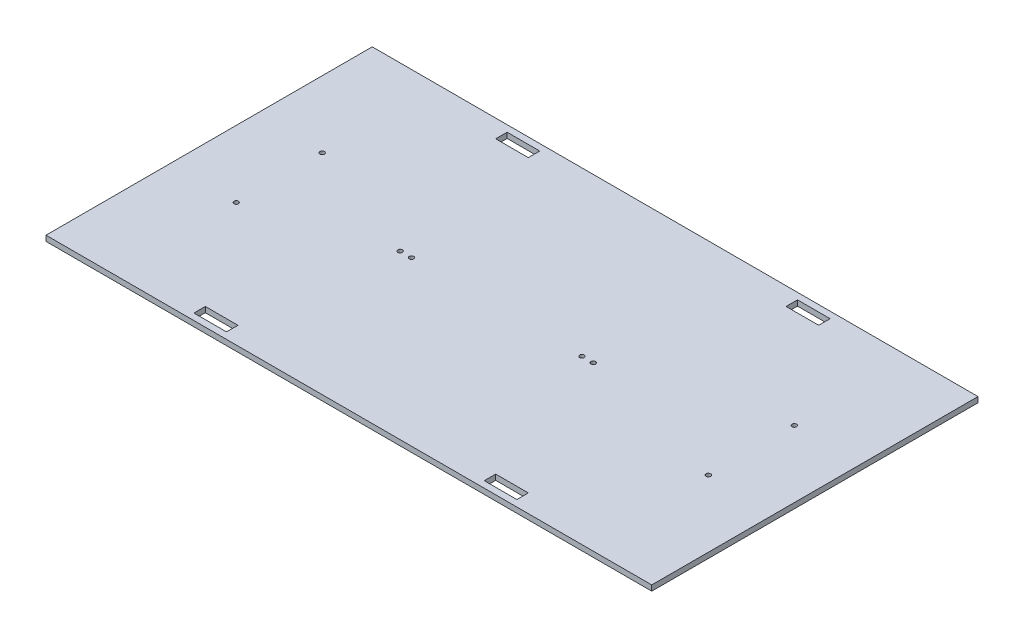
ISO-10303-21;
HEADER;
FILE_DESCRIPTION(('STEP AP214'),'2;1');
FILE_NAME('part.step','',(''),(''),'','','');
FILE_SCHEMA(('AUTOMOTIVE_DESIGN { 1 0 10303 214 1 1 1 1 }'));
ENDSEC;
DATA;
#1=APPLICATION_CONTEXT('core data for automotive mechanical design processes');
#2=APPLICATION_PROTOCOL_DEFINITION('international standard','automotive_design',2000,#1);
#3=PRODUCT_CONTEXT('',#1,'mechanical');
#4=PRODUCT('Part','Part','',(#3));
#5=PRODUCT_RELATED_PRODUCT_CATEGORY('part','',(#4));
#6=PRODUCT_DEFINITION_FORMATION('','',#4);
#7=PRODUCT_DEFINITION_CONTEXT('part definition',#1,'design');
#8=PRODUCT_DEFINITION('design','',#6,#7);
#9=PRODUCT_DEFINITION_SHAPE('','',#8);
#10=(LENGTH_UNIT() NAMED_UNIT(*) SI_UNIT(.MILLI.,.METRE.));
#11=(NAMED_UNIT(*) PLANE_ANGLE_UNIT() SI_UNIT($,.RADIAN.));
#12=(NAMED_UNIT(*) SI_UNIT($,.STERADIAN.) SOLID_ANGLE_UNIT());
#13=UNCERTAINTY_MEASURE_WITH_UNIT(LENGTH_MEASURE(1.E-05),#10,'distance_accuracy_value','');
#14=(GEOMETRIC_REPRESENTATION_CONTEXT(3) GLOBAL_UNCERTAINTY_ASSIGNED_CONTEXT((#13)) GLOBAL_UNIT_ASSIGNED_CONTEXT((#10,
#11,#12)) REPRESENTATION_CONTEXT('',''));
#15=CARTESIAN_POINT('',(0.,0.,0.));
#16=DIRECTION('',(0.,0.,1.));
#17=DIRECTION('',(1.,0.,0.));
#18=AXIS2_PLACEMENT_3D('',#15,#16,#17);
#19=CARTESIAN_POINT('',(278.5,5.,-150.));
#20=DIRECTION('',(-1.,0.,0.));
#21=DIRECTION('',(0.,0.,1.));
#22=AXIS2_PLACEMENT_3D('',#19,#20,#21);
#23=PLANE('',#22);
#24=DIRECTION('',(0.,0.,-1.));
#25=VECTOR('',#24,1.);
#26=CARTESIAN_POINT('',(278.5,0.,-150.));
#27=LINE('',#26,#25);
#28=CARTESIAN_POINT('',(278.5,0.,150.));
#29=VERTEX_POINT('',#28);
#30=CARTESIAN_POINT('',(278.5,0.,-150.));
#31=VERTEX_POINT('',#30);
#32=EDGE_CURVE('E414',#29,#31,#27,.T.);
#33=ORIENTED_EDGE('',*,*,#32,.T.);
#34=DIRECTION('',(0.,-1.,0.));
#35=VECTOR('',#34,1.);
#36=CARTESIAN_POINT('',(278.5,5.,-150.));
#37=LINE('',#36,#35);
#38=CARTESIAN_POINT('',(278.5,5.,-150.));
#39=VERTEX_POINT('',#38);
#40=EDGE_CURVE('E11',#39,#31,#37,.T.);
#41=ORIENTED_EDGE('',*,*,#40,.F.);
#42=DIRECTION('',(0.,0.,-1.));
#43=VECTOR('',#42,1.);
#44=CARTESIAN_POINT('',(278.5,5.,-150.));
#45=LINE('',#44,#43);
#46=CARTESIAN_POINT('',(278.5,5.,150.));
#47=VERTEX_POINT('',#46);
#48=EDGE_CURVE('E415',#47,#39,#45,.T.);
#49=ORIENTED_EDGE('',*,*,#48,.F.);
#50=DIRECTION('',(0.,-1.,0.));
#51=VECTOR('',#50,1.);
#52=CARTESIAN_POINT('',(278.5,5.,150.));
#53=LINE('',#52,#51);
#54=EDGE_CURVE('E429',#47,#29,#53,.T.);
#55=ORIENTED_EDGE('',*,*,#54,.T.);
#56=EDGE_LOOP('',(#33,#41,#49,#55));
#57=FACE_BOUND('',#56,.T.);
#58=ADVANCED_FACE('F42',(#57),#23,.F.);
#59=CARTESIAN_POINT('',(-278.5,5.,-150.));
#60=DIRECTION('',(0.,0.,1.));
#61=DIRECTION('',(1.,0.,0.));
#62=AXIS2_PLACEMENT_3D('',#59,#60,#61);
#63=PLANE('',#62);
#64=DIRECTION('',(-1.,0.,0.));
#65=VECTOR('',#64,1.);
#66=CARTESIAN_POINT('',(-278.5,0.,-150.));
#67=LINE('',#66,#65);
#68=CARTESIAN_POINT('',(-278.5,0.,-150.));
#69=VERTEX_POINT('',#68);
#70=EDGE_CURVE('E433',#31,#69,#67,.T.);
#71=ORIENTED_EDGE('',*,*,#70,.T.);
#72=DIRECTION('',(0.,-1.,0.));
#73=VECTOR('',#72,1.);
#74=CARTESIAN_POINT('',(-278.5,5.,-150.));
#75=LINE('',#74,#73);
#76=CARTESIAN_POINT('',(-278.5,5.,-150.));
#77=VERTEX_POINT('',#76);
#78=EDGE_CURVE('E50',#77,#69,#75,.T.);
#79=ORIENTED_EDGE('',*,*,#78,.F.);
#80=DIRECTION('',(-1.,0.,0.));
#81=VECTOR('',#80,1.);
#82=CARTESIAN_POINT('',(-278.5,5.,-150.));
#83=LINE('',#82,#81);
#84=EDGE_CURVE('E419',#39,#77,#83,.T.);
#85=ORIENTED_EDGE('',*,*,#84,.F.);
#86=ORIENTED_EDGE('',*,*,#40,.T.);
#87=EDGE_LOOP('',(#71,#79,#85,#86));
#88=FACE_BOUND('',#87,.T.);
#89=ADVANCED_FACE('F469',(#88),#63,.F.);
#90=CARTESIAN_POINT('',(-278.5,5.,-150.));
#91=DIRECTION('',(1.,0.,0.));
#92=DIRECTION('',(0.,0.,-1.));
#93=AXIS2_PLACEMENT_3D('',#90,#91,#92);
#94=PLANE('',#93);
#95=DIRECTION('',(0.,0.,1.));
#96=VECTOR('',#95,1.);
#97=CARTESIAN_POINT('',(-278.5,0.,-150.));
#98=LINE('',#97,#96);
#99=CARTESIAN_POINT('',(-278.5,0.,150.));
#100=VERTEX_POINT('',#99);
#101=EDGE_CURVE('E436',#69,#100,#98,.T.);
#102=ORIENTED_EDGE('',*,*,#101,.T.);
#103=DIRECTION('',(0.,-1.,0.));
#104=VECTOR('',#103,1.);
#105=CARTESIAN_POINT('',(-278.5,5.,150.));
#106=LINE('',#105,#104);
#107=CARTESIAN_POINT('',(-278.5,5.,150.));
#108=VERTEX_POINT('',#107);
#109=EDGE_CURVE('E444',#108,#100,#106,.T.);
#110=ORIENTED_EDGE('',*,*,#109,.F.);
#111=DIRECTION('',(0.,0.,1.));
#112=VECTOR('',#111,1.);
#113=CARTESIAN_POINT('',(-278.5,5.,-150.));
#114=LINE('',#113,#112);
#115=EDGE_CURVE('E423',#77,#108,#114,.T.);
#116=ORIENTED_EDGE('',*,*,#115,.F.);
#117=ORIENTED_EDGE('',*,*,#78,.T.);
#118=EDGE_LOOP('',(#102,#110,#116,#117));
#119=FACE_BOUND('',#118,.T.);
#120=ADVANCED_FACE('F454',(#119),#94,.F.);
#121=CARTESIAN_POINT('',(-278.5,5.,150.));
#122=DIRECTION('',(0.,0.,-1.));
#123=DIRECTION('',(-1.,0.,0.));
#124=AXIS2_PLACEMENT_3D('',#121,#122,#123);
#125=PLANE('',#124);
#126=DIRECTION('',(1.,0.,0.));
#127=VECTOR('',#126,1.);
#128=CARTESIAN_POINT('',(-278.5,0.,150.));
#129=LINE('',#128,#127);
#130=EDGE_CURVE('E420',#100,#29,#129,.T.);
#131=ORIENTED_EDGE('',*,*,#130,.T.);
#132=ORIENTED_EDGE('',*,*,#54,.F.);
#133=DIRECTION('',(1.,0.,0.));
#134=VECTOR('',#133,1.);
#135=CARTESIAN_POINT('',(-278.5,5.,150.));
#136=LINE('',#135,#134);
#137=EDGE_CURVE('E426',#108,#47,#136,.T.);
#138=ORIENTED_EDGE('',*,*,#137,.F.);
#139=ORIENTED_EDGE('',*,*,#109,.T.);
#140=EDGE_LOOP('',(#131,#132,#138,#139));
#141=FACE_BOUND('',#140,.T.);
#142=ADVANCED_FACE('F462',(#141),#125,.F.);
#143=CARTESIAN_POINT('',(0.,5.,0.));
#144=DIRECTION('',(0.,1.,0.));
#145=DIRECTION('',(0.,0.,1.));
#146=AXIS2_PLACEMENT_3D('',#143,#144,#145);
#147=PLANE('',#146);
#148=DIRECTION('',(1.,0.,0.));
#149=VECTOR('',#148,1.);
#150=CARTESIAN_POINT('',(0.,5.,-133.5));
#151=LINE('',#150,#149);
#152=CARTESIAN_POINT('',(118.5,5.,-133.5));
#153=VERTEX_POINT('',#152);
#154=CARTESIAN_POINT('',(148.5,5.,-133.5));
#155=VERTEX_POINT('',#154);
#156=EDGE_CURVE('E348',#153,#155,#151,.T.);
#157=ORIENTED_EDGE('',*,*,#156,.F.);
#158=DIRECTION('',(0.,0.,1.));
#159=VECTOR('',#158,1.);
#160=CARTESIAN_POINT('',(118.5,5.,0.));
#161=LINE('',#160,#159);
#162=CARTESIAN_POINT('',(118.5,5.,-144.));
#163=VERTEX_POINT('',#162);
#164=EDGE_CURVE('E340',#163,#153,#161,.T.);
#165=ORIENTED_EDGE('',*,*,#164,.F.);
#166=DIRECTION('',(-1.,0.,0.));
#167=VECTOR('',#166,1.);
#168=CARTESIAN_POINT('',(0.,5.,-144.));
#169=LINE('',#168,#167);
#170=CARTESIAN_POINT('',(148.5,5.,-144.));
#171=VERTEX_POINT('',#170);
#172=EDGE_CURVE('E342',#171,#163,#169,.T.);
#173=ORIENTED_EDGE('',*,*,#172,.F.);
#174=DIRECTION('',(0.,0.,-1.));
#175=VECTOR('',#174,1.);
#176=CARTESIAN_POINT('',(148.5,5.,0.));
#177=LINE('',#176,#175);
#178=EDGE_CURVE('E345',#155,#171,#177,.T.);
#179=ORIENTED_EDGE('',*,*,#178,.F.);
#180=EDGE_LOOP('',(#157,#165,#173,#179));
#181=FACE_BOUND('',#180,.T.);
#182=DIRECTION('',(0.,0.,1.));
#183=VECTOR('',#182,1.);
#184=CARTESIAN_POINT('',(-148.5,5.,0.));
#185=LINE('',#184,#183);
#186=CARTESIAN_POINT('',(-148.5,5.,-144.));
#187=VERTEX_POINT('',#186);
#188=CARTESIAN_POINT('',(-148.5,5.,-133.5));
#189=VERTEX_POINT('',#188);
#190=EDGE_CURVE('E337',#187,#189,#185,.T.);
#191=ORIENTED_EDGE('',*,*,#190,.F.);
#192=DIRECTION('',(-1.,0.,0.));
#193=VECTOR('',#192,1.);
#194=CARTESIAN_POINT('',(0.,5.,-144.));
#195=LINE('',#194,#193);
#196=CARTESIAN_POINT('',(-118.5,5.,-144.));
#197=VERTEX_POINT('',#196);
#198=EDGE_CURVE('E328',#197,#187,#195,.T.);
#199=ORIENTED_EDGE('',*,*,#198,.F.);
#200=DIRECTION('',(0.,0.,-1.));
#201=VECTOR('',#200,1.);
#202=CARTESIAN_POINT('',(-118.5,5.,0.));
#203=LINE('',#202,#201);
#204=CARTESIAN_POINT('',(-118.5,5.,-133.5));
#205=VERTEX_POINT('',#204);
#206=EDGE_CURVE('E331',#205,#197,#203,.T.);
#207=ORIENTED_EDGE('',*,*,#206,.F.);
#208=DIRECTION('',(1.,0.,0.));
#209=VECTOR('',#208,1.);
#210=CARTESIAN_POINT('',(0.,5.,-133.5));
#211=LINE('',#210,#209);
#212=EDGE_CURVE('E334',#189,#205,#211,.T.);
#213=ORIENTED_EDGE('',*,*,#212,.F.);
#214=EDGE_LOOP('',(#191,#199,#207,#213));
#215=FACE_BOUND('',#214,.T.);
#216=DIRECTION('',(-1.,0.,0.));
#217=VECTOR('',#216,1.);
#218=CARTESIAN_POINT('',(0.,5.,133.5));
#219=LINE('',#218,#217);
#220=CARTESIAN_POINT('',(-118.5,5.,133.5));
#221=VERTEX_POINT('',#220);
#222=CARTESIAN_POINT('',(-148.5,5.,133.5));
#223=VERTEX_POINT('',#222);
#224=EDGE_CURVE('E325',#221,#223,#219,.T.);
#225=ORIENTED_EDGE('',*,*,#224,.F.);
#226=DIRECTION('',(0.,0.,-1.));
#227=VECTOR('',#226,1.);
#228=CARTESIAN_POINT('',(-118.5,5.,0.));
#229=LINE('',#228,#227);
#230=CARTESIAN_POINT('',(-118.5,5.,144.));
#231=VERTEX_POINT('',#230);
#232=EDGE_CURVE('E317',#231,#221,#229,.T.);
#233=ORIENTED_EDGE('',*,*,#232,.F.);
#234=DIRECTION('',(1.,0.,0.));
#235=VECTOR('',#234,1.);
#236=CARTESIAN_POINT('',(0.,5.,144.));
#237=LINE('',#236,#235);
#238=CARTESIAN_POINT('',(-148.5,5.,144.));
#239=VERTEX_POINT('',#238);
#240=EDGE_CURVE('E187',#239,#231,#237,.T.);
#241=ORIENTED_EDGE('',*,*,#240,.F.);
#242=DIRECTION('',(0.,0.,1.));
#243=VECTOR('',#242,1.);
#244=CARTESIAN_POINT('',(-148.5,5.,0.));
#245=LINE('',#244,#243);
#246=EDGE_CURVE('E322',#223,#239,#245,.T.);
#247=ORIENTED_EDGE('',*,*,#246,.F.);
#248=EDGE_LOOP('',(#225,#233,#241,#247));
#249=FACE_BOUND('',#248,.T.);
#250=DIRECTION('',(0.,0.,-1.));
#251=VECTOR('',#250,1.);
#252=CARTESIAN_POINT('',(148.5,5.,0.));
#253=LINE('',#252,#251);
#254=CARTESIAN_POINT('',(148.5,5.,144.));
#255=VERTEX_POINT('',#254);
#256=CARTESIAN_POINT('',(148.5,5.,133.5));
#257=VERTEX_POINT('',#256);
#258=EDGE_CURVE('E314',#255,#257,#253,.T.);
#259=ORIENTED_EDGE('',*,*,#258,.F.);
#260=DIRECTION('',(1.,0.,0.));
#261=VECTOR('',#260,1.);
#262=CARTESIAN_POINT('',(0.,5.,144.));
#263=LINE('',#262,#261);
#264=CARTESIAN_POINT('',(118.5,5.,144.));
#265=VERTEX_POINT('',#264);
#266=EDGE_CURVE('E295',#265,#255,#263,.T.);
#267=ORIENTED_EDGE('',*,*,#266,.F.);
#268=DIRECTION('',(0.,0.,1.));
#269=VECTOR('',#268,1.);
#270=CARTESIAN_POINT('',(118.5,5.,0.));
#271=LINE('',#270,#269);
#272=CARTESIAN_POINT('',(118.5,5.,133.5));
#273=VERTEX_POINT('',#272);
#274=EDGE_CURVE('E307',#273,#265,#271,.T.);
#275=ORIENTED_EDGE('',*,*,#274,.F.);
#276=DIRECTION('',(-1.,0.,0.));
#277=VECTOR('',#276,1.);
#278=CARTESIAN_POINT('',(0.,5.,133.5));
#279=LINE('',#278,#277);
#280=EDGE_CURVE('E311',#257,#273,#279,.T.);
#281=ORIENTED_EDGE('',*,*,#280,.F.);
#282=EDGE_LOOP('',(#259,#267,#275,#281));
#283=FACE_BOUND('',#282,.T.);
#284=CARTESIAN_POINT('',(217.06,5.,-42.52));
#285=DIRECTION('',(0.,1.,0.));
#286=DIRECTION('',(0.,0.,1.));
#287=AXIS2_PLACEMENT_3D('',#284,#285,#286);
#288=CIRCLE('',#287,2.09999999999999);
#289=CARTESIAN_POINT('',(217.06,5.,-40.42));
#290=VERTEX_POINT('',#289);
#291=EDGE_CURVE('E378',#290,#290,#288,.T.);
#292=ORIENTED_EDGE('',*,*,#291,.F.);
#293=EDGE_LOOP('',(#292));
#294=FACE_BOUND('',#293,.T.);
#295=CARTESIAN_POINT('',(217.06,5.,36.4800000000001));
#296=DIRECTION('',(0.,1.,0.));
#297=DIRECTION('',(0.,0.,1.));
#298=AXIS2_PLACEMENT_3D('',#295,#296,#297);
#299=CIRCLE('',#298,2.09999999999999);
#300=CARTESIAN_POINT('',(217.06,5.,38.58));
#301=VERTEX_POINT('',#300);
#302=EDGE_CURVE('E374',#301,#301,#299,.T.);
#303=ORIENTED_EDGE('',*,*,#302,.F.);
#304=EDGE_LOOP('',(#303));
#305=FACE_BOUND('',#304,.T.);
#306=CARTESIAN_POINT('',(-217.06,5.,36.4800000000001));
#307=DIRECTION('',(0.,1.,0.));
#308=DIRECTION('',(0.,0.,1.));
#309=AXIS2_PLACEMENT_3D('',#306,#307,#308);
#310=CIRCLE('',#309,2.09999999999999);
#311=CARTESIAN_POINT('',(-217.06,5.,38.58));
#312=VERTEX_POINT('',#311);
#313=EDGE_CURVE('E370',#312,#312,#310,.T.);
#314=ORIENTED_EDGE('',*,*,#313,.F.);
#315=EDGE_LOOP('',(#314));
#316=FACE_BOUND('',#315,.T.);
#317=CARTESIAN_POINT('',(-217.06,5.,-42.52));
#318=DIRECTION('',(0.,1.,0.));
#319=DIRECTION('',(0.,0.,1.));
#320=AXIS2_PLACEMENT_3D('',#317,#318,#319);
#321=CIRCLE('',#320,2.09999999999999);
#322=CARTESIAN_POINT('',(-217.06,5.,-40.42));
#323=VERTEX_POINT('',#322);
#324=EDGE_CURVE('E366',#323,#323,#321,.T.);
#325=ORIENTED_EDGE('',*,*,#324,.F.);
#326=EDGE_LOOP('',(#325));
#327=FACE_BOUND('',#326,.T.);
#328=CARTESIAN_POINT('',(-102.995469166252,5.,-0.150780626409678));
#329=DIRECTION('',(0.,1.,0.));
#330=DIRECTION('',(0.,0.,1.));
#331=AXIS2_PLACEMENT_3D('',#328,#329,#330);
#332=CIRCLE('',#331,2.1);
#333=CARTESIAN_POINT('',(-102.995469166252,5.,1.94921937359033));
#334=VERTEX_POINT('',#333);
#335=EDGE_CURVE('E410',#334,#334,#332,.T.);
#336=ORIENTED_EDGE('',*,*,#335,.F.);
#337=EDGE_LOOP('',(#336));
#338=FACE_BOUND('',#337,.T.);
#339=CARTESIAN_POINT('',(-92.5902008962103,5.,-0.150780626409678));
#340=DIRECTION('',(0.,1.,0.));
#341=DIRECTION('',(0.,0.,1.));
#342=AXIS2_PLACEMENT_3D('',#339,#340,#341);
#343=CIRCLE('',#342,2.09999999999999);
#344=CARTESIAN_POINT('',(-92.5902008962103,5.,1.94921937359031));
#345=VERTEX_POINT('',#344);
#346=EDGE_CURVE('E406',#345,#345,#343,.T.);
#347=ORIENTED_EDGE('',*,*,#346,.F.);
#348=EDGE_LOOP('',(#347));
#349=FACE_BOUND('',#348,.T.);
#350=CARTESIAN_POINT('',(74.7319267324702,5.,0.));
#351=DIRECTION('',(0.,1.,0.));
#352=DIRECTION('',(0.,0.,1.));
#353=AXIS2_PLACEMENT_3D('',#350,#351,#352);
#354=CIRCLE('',#353,2.1);
#355=CARTESIAN_POINT('',(74.7319267324702,5.,2.10000000000003));
#356=VERTEX_POINT('',#355);
#357=EDGE_CURVE('E402',#356,#356,#354,.T.);
#358=ORIENTED_EDGE('',*,*,#357,.F.);
#359=EDGE_LOOP('',(#358));
#360=FACE_BOUND('',#359,.T.);
#361=CARTESIAN_POINT('',(64.3600000000001,5.,0.));
#362=DIRECTION('',(0.,1.,0.));
#363=DIRECTION('',(0.,0.,1.));
#364=AXIS2_PLACEMENT_3D('',#361,#362,#363);
#365=CIRCLE('',#364,2.09999999999999);
#366=CARTESIAN_POINT('',(64.3600000000001,5.,2.10000000000002));
#367=VERTEX_POINT('',#366);
#368=EDGE_CURVE('E398',#367,#367,#365,.T.);
#369=ORIENTED_EDGE('',*,*,#368,.F.);
#370=EDGE_LOOP('',(#369));
#371=FACE_BOUND('',#370,.T.);
#372=ORIENTED_EDGE('',*,*,#48,.T.);
#373=ORIENTED_EDGE('',*,*,#84,.T.);
#374=ORIENTED_EDGE('',*,*,#115,.T.);
#375=ORIENTED_EDGE('',*,*,#137,.T.);
#376=EDGE_LOOP('',(#372,#373,#374,#375));
#377=FACE_BOUND('',#376,.T.);
#378=ADVANCED_FACE('F468',(#181,#215,#249,#283,#294,#305,#316,#327,#338,#349,#360,#371,#377),
#147,.T.);
#379=CARTESIAN_POINT('',(0.,0.,0.));
#380=DIRECTION('',(0.,1.,0.));
#381=DIRECTION('',(0.,0.,1.));
#382=AXIS2_PLACEMENT_3D('',#379,#380,#381);
#383=PLANE('',#382);
#384=DIRECTION('',(0.,0.,-1.));
#385=VECTOR('',#384,1.);
#386=CARTESIAN_POINT('',(118.5,0.,-133.5));
#387=LINE('',#386,#385);
#388=CARTESIAN_POINT('',(118.5,0.,-133.5));
#389=VERTEX_POINT('',#388);
#390=CARTESIAN_POINT('',(118.5,0.,-144.));
#391=VERTEX_POINT('',#390);
#392=EDGE_CURVE('E255',#389,#391,#387,.T.);
#393=ORIENTED_EDGE('',*,*,#392,.F.);
#394=DIRECTION('',(-1.,0.,0.));
#395=VECTOR('',#394,1.);
#396=CARTESIAN_POINT('',(148.5,0.,-133.5));
#397=LINE('',#396,#395);
#398=CARTESIAN_POINT('',(148.5,0.,-133.5));
#399=VERTEX_POINT('',#398);
#400=EDGE_CURVE('E252',#399,#389,#397,.T.);
#401=ORIENTED_EDGE('',*,*,#400,.F.);
#402=DIRECTION('',(0.,0.,1.));
#403=VECTOR('',#402,1.);
#404=CARTESIAN_POINT('',(148.5,0.,-133.5));
#405=LINE('',#404,#403);
#406=CARTESIAN_POINT('',(148.5,0.,-144.));
#407=VERTEX_POINT('',#406);
#408=EDGE_CURVE('E262',#407,#399,#405,.T.);
#409=ORIENTED_EDGE('',*,*,#408,.F.);
#410=DIRECTION('',(1.,0.,0.));
#411=VECTOR('',#410,1.);
#412=CARTESIAN_POINT('',(148.5,0.,-144.));
#413=LINE('',#412,#411);
#414=EDGE_CURVE('E258',#391,#407,#413,.T.);
#415=ORIENTED_EDGE('',*,*,#414,.F.);
#416=EDGE_LOOP('',(#393,#401,#409,#415));
#417=FACE_BOUND('',#416,.T.);
#418=DIRECTION('',(1.,0.,0.));
#419=VECTOR('',#418,1.);
#420=CARTESIAN_POINT('',(-148.5,0.,-144.));
#421=LINE('',#420,#419);
#422=CARTESIAN_POINT('',(-148.5,0.,-144.));
#423=VERTEX_POINT('',#422);
#424=CARTESIAN_POINT('',(-118.5,0.,-144.));
#425=VERTEX_POINT('',#424);
#426=EDGE_CURVE('E228',#423,#425,#421,.T.);
#427=ORIENTED_EDGE('',*,*,#426,.F.);
#428=DIRECTION('',(0.,0.,-1.));
#429=VECTOR('',#428,1.);
#430=CARTESIAN_POINT('',(-148.5,0.,-133.5));
#431=LINE('',#430,#429);
#432=CARTESIAN_POINT('',(-148.5,0.,-133.5));
#433=VERTEX_POINT('',#432);
#434=EDGE_CURVE('E225',#433,#423,#431,.T.);
#435=ORIENTED_EDGE('',*,*,#434,.F.);
#436=DIRECTION('',(-1.,0.,0.));
#437=VECTOR('',#436,1.);
#438=CARTESIAN_POINT('',(-148.5,0.,-133.5));
#439=LINE('',#438,#437);
#440=CARTESIAN_POINT('',(-118.5,0.,-133.5));
#441=VERTEX_POINT('',#440);
#442=EDGE_CURVE('E236',#441,#433,#439,.T.);
#443=ORIENTED_EDGE('',*,*,#442,.F.);
#444=DIRECTION('',(0.,0.,1.));
#445=VECTOR('',#444,1.);
#446=CARTESIAN_POINT('',(-118.5,0.,-133.5));
#447=LINE('',#446,#445);
#448=EDGE_CURVE('E232',#425,#441,#447,.T.);
#449=ORIENTED_EDGE('',*,*,#448,.F.);
#450=EDGE_LOOP('',(#427,#435,#443,#449));
#451=FACE_BOUND('',#450,.T.);
#452=DIRECTION('',(0.,0.,1.));
#453=VECTOR('',#452,1.);
#454=CARTESIAN_POINT('',(-118.5,0.,133.5));
#455=LINE('',#454,#453);
#456=CARTESIAN_POINT('',(-118.5,0.,133.5));
#457=VERTEX_POINT('',#456);
#458=CARTESIAN_POINT('',(-118.5,0.,144.));
#459=VERTEX_POINT('',#458);
#460=EDGE_CURVE('E196',#457,#459,#455,.T.);
#461=ORIENTED_EDGE('',*,*,#460,.F.);
#462=DIRECTION('',(1.,0.,0.));
#463=VECTOR('',#462,1.);
#464=CARTESIAN_POINT('',(-148.5,0.,133.5));
#465=LINE('',#464,#463);
#466=CARTESIAN_POINT('',(-148.5,0.,133.5));
#467=VERTEX_POINT('',#466);
#468=EDGE_CURVE('E202',#467,#457,#465,.T.);
#469=ORIENTED_EDGE('',*,*,#468,.F.);
#470=DIRECTION('',(0.,0.,-1.));
#471=VECTOR('',#470,1.);
#472=CARTESIAN_POINT('',(-148.5,0.,133.5));
#473=LINE('',#472,#471);
#474=CARTESIAN_POINT('',(-148.5,0.,144.));
#475=VERTEX_POINT('',#474);
#476=EDGE_CURVE('E207',#475,#467,#473,.T.);
#477=ORIENTED_EDGE('',*,*,#476,.F.);
#478=DIRECTION('',(-1.,0.,0.));
#479=VECTOR('',#478,1.);
#480=CARTESIAN_POINT('',(-148.5,0.,144.));
#481=LINE('',#480,#479);
#482=EDGE_CURVE('E184',#459,#475,#481,.T.);
#483=ORIENTED_EDGE('',*,*,#482,.F.);
#484=EDGE_LOOP('',(#461,#469,#477,#483));
#485=FACE_BOUND('',#484,.T.);
#486=DIRECTION('',(-1.,0.,0.));
#487=VECTOR('',#486,1.);
#488=CARTESIAN_POINT('',(148.5,0.,144.));
#489=LINE('',#488,#487);
#490=CARTESIAN_POINT('',(148.5,0.,144.));
#491=VERTEX_POINT('',#490);
#492=CARTESIAN_POINT('',(118.5,0.,144.));
#493=VERTEX_POINT('',#492);
#494=EDGE_CURVE('E279',#491,#493,#489,.T.);
#495=ORIENTED_EDGE('',*,*,#494,.F.);
#496=DIRECTION('',(0.,0.,1.));
#497=VECTOR('',#496,1.);
#498=CARTESIAN_POINT('',(148.5,0.,133.5));
#499=LINE('',#498,#497);
#500=CARTESIAN_POINT('',(148.5,0.,133.5));
#501=VERTEX_POINT('',#500);
#502=EDGE_CURVE('E220',#501,#491,#499,.T.);
#503=ORIENTED_EDGE('',*,*,#502,.F.);
#504=DIRECTION('',(1.,0.,0.));
#505=VECTOR('',#504,1.);
#506=CARTESIAN_POINT('',(148.5,0.,133.5));
#507=LINE('',#506,#505);
#508=CARTESIAN_POINT('',(118.5,0.,133.5));
#509=VERTEX_POINT('',#508);
#510=EDGE_CURVE('E287',#509,#501,#507,.T.);
#511=ORIENTED_EDGE('',*,*,#510,.F.);
#512=DIRECTION('',(0.,0.,-1.));
#513=VECTOR('',#512,1.);
#514=CARTESIAN_POINT('',(118.5,0.,133.5));
#515=LINE('',#514,#513);
#516=EDGE_CURVE('E283',#493,#509,#515,.T.);
#517=ORIENTED_EDGE('',*,*,#516,.F.);
#518=EDGE_LOOP('',(#495,#503,#511,#517));
#519=FACE_BOUND('',#518,.T.);
#520=CARTESIAN_POINT('',(217.06,0.,-42.52));
#521=DIRECTION('',(0.,-1.,0.));
#522=DIRECTION('',(0.,0.,1.));
#523=AXIS2_PLACEMENT_3D('',#520,#521,#522);
#524=CIRCLE('',#523,2.09999999999999);
#525=CARTESIAN_POINT('',(217.06,0.,-40.42));
#526=VERTEX_POINT('',#525);
#527=EDGE_CURVE('E351',#526,#526,#524,.T.);
#528=ORIENTED_EDGE('',*,*,#527,.F.);
#529=EDGE_LOOP('',(#528));
#530=FACE_BOUND('',#529,.T.);
#531=CARTESIAN_POINT('',(217.06,0.,36.4800000000001));
#532=DIRECTION('',(0.,-1.,0.));
#533=DIRECTION('',(0.,0.,1.));
#534=AXIS2_PLACEMENT_3D('',#531,#532,#533);
#535=CIRCLE('',#534,2.09999999999999);
#536=CARTESIAN_POINT('',(217.06,0.,38.58));
#537=VERTEX_POINT('',#536);
#538=EDGE_CURVE('E357',#537,#537,#535,.T.);
#539=ORIENTED_EDGE('',*,*,#538,.F.);
#540=EDGE_LOOP('',(#539));
#541=FACE_BOUND('',#540,.T.);
#542=CARTESIAN_POINT('',(-217.06,0.,36.4800000000001));
#543=DIRECTION('',(0.,-1.,0.));
#544=DIRECTION('',(0.,0.,-1.));
#545=AXIS2_PLACEMENT_3D('',#542,#543,#544);
#546=CIRCLE('',#545,2.09999999999999);
#547=CARTESIAN_POINT('',(-217.06,0.,34.3800000000001));
#548=VERTEX_POINT('',#547);
#549=EDGE_CURVE('E352',#548,#548,#546,.T.);
#550=ORIENTED_EDGE('',*,*,#549,.F.);
#551=EDGE_LOOP('',(#550));
#552=FACE_BOUND('',#551,.T.);
#553=CARTESIAN_POINT('',(-217.06,0.,-42.52));
#554=DIRECTION('',(0.,-1.,0.));
#555=DIRECTION('',(0.,0.,-1.));
#556=AXIS2_PLACEMENT_3D('',#553,#554,#555);
#557=CIRCLE('',#556,2.09999999999999);
#558=CARTESIAN_POINT('',(-217.06,0.,-44.62));
#559=VERTEX_POINT('',#558);
#560=EDGE_CURVE('E356',#559,#559,#557,.T.);
#561=ORIENTED_EDGE('',*,*,#560,.F.);
#562=EDGE_LOOP('',(#561));
#563=FACE_BOUND('',#562,.T.);
#564=CARTESIAN_POINT('',(-102.995469166252,0.,-0.150780626409678));
#565=DIRECTION('',(0.,-1.,0.));
#566=DIRECTION('',(0.,0.,1.));
#567=AXIS2_PLACEMENT_3D('',#564,#565,#566);
#568=CIRCLE('',#567,2.1);
#569=CARTESIAN_POINT('',(-102.995469166252,0.,1.94921937359033));
#570=VERTEX_POINT('',#569);
#571=EDGE_CURVE('E382',#570,#570,#568,.T.);
#572=ORIENTED_EDGE('',*,*,#571,.F.);
#573=EDGE_LOOP('',(#572));
#574=FACE_BOUND('',#573,.T.);
#575=CARTESIAN_POINT('',(-92.5902008962103,0.,-0.150780626409678));
#576=DIRECTION('',(0.,-1.,0.));
#577=DIRECTION('',(0.,0.,1.));
#578=AXIS2_PLACEMENT_3D('',#575,#576,#577);
#579=CIRCLE('',#578,2.09999999999999);
#580=CARTESIAN_POINT('',(-92.5902008962103,0.,1.94921937359031));
#581=VERTEX_POINT('',#580);
#582=EDGE_CURVE('E388',#581,#581,#579,.T.);
#583=ORIENTED_EDGE('',*,*,#582,.F.);
#584=EDGE_LOOP('',(#583));
#585=FACE_BOUND('',#584,.T.);
#586=CARTESIAN_POINT('',(74.7319267324702,0.,0.));
#587=DIRECTION('',(0.,-1.,0.));
#588=DIRECTION('',(0.,0.,-1.));
#589=AXIS2_PLACEMENT_3D('',#586,#587,#588);
#590=CIRCLE('',#589,2.1);
#591=CARTESIAN_POINT('',(74.7319267324702,0.,-2.09999999999998));
#592=VERTEX_POINT('',#591);
#593=EDGE_CURVE('E383',#592,#592,#590,.T.);
#594=ORIENTED_EDGE('',*,*,#593,.F.);
#595=EDGE_LOOP('',(#594));
#596=FACE_BOUND('',#595,.T.);
#597=CARTESIAN_POINT('',(64.3600000000001,0.,0.));
#598=DIRECTION('',(0.,-1.,0.));
#599=DIRECTION('',(0.,0.,-1.));
#600=AXIS2_PLACEMENT_3D('',#597,#598,#599);
#601=CIRCLE('',#600,2.09999999999999);
#602=CARTESIAN_POINT('',(64.3600000000001,0.,-2.09999999999996));
#603=VERTEX_POINT('',#602);
#604=EDGE_CURVE('E387',#603,#603,#601,.T.);
#605=ORIENTED_EDGE('',*,*,#604,.F.);
#606=EDGE_LOOP('',(#605));
#607=FACE_BOUND('',#606,.T.);
#608=ORIENTED_EDGE('',*,*,#32,.F.);
#609=ORIENTED_EDGE('',*,*,#130,.F.);
#610=ORIENTED_EDGE('',*,*,#101,.F.);
#611=ORIENTED_EDGE('',*,*,#70,.F.);
#612=EDGE_LOOP('',(#608,#609,#610,#611));
#613=FACE_BOUND('',#612,.T.);
#614=ADVANCED_FACE('F204',(#417,#451,#485,#519,#530,#541,#552,#563,#574,#585,#596,#607,#613),
#383,.F.);
#615=CARTESIAN_POINT('',(64.3600000000001,10.,0.));
#616=DIRECTION('',(0.,-1.,0.));
#617=DIRECTION('',(0.,0.,-1.));
#618=AXIS2_PLACEMENT_3D('',#615,#616,#617);
#619=CYLINDRICAL_SURFACE('',#618,2.09999999999999);
#620=ORIENTED_EDGE('',*,*,#368,.T.);
#621=EDGE_LOOP('',(#620));
#622=FACE_BOUND('',#621,.T.);
#623=ORIENTED_EDGE('',*,*,#604,.T.);
#624=EDGE_LOOP('',(#623));
#625=FACE_BOUND('',#624,.T.);
#626=ADVANCED_FACE('F481',(#622,#625),#619,.F.);
#627=CARTESIAN_POINT('',(74.7319267324702,10.,0.));
#628=DIRECTION('',(0.,-1.,0.));
#629=DIRECTION('',(0.,0.,-1.));
#630=AXIS2_PLACEMENT_3D('',#627,#628,#629);
#631=CYLINDRICAL_SURFACE('',#630,2.1);
#632=ORIENTED_EDGE('',*,*,#357,.T.);
#633=EDGE_LOOP('',(#632));
#634=FACE_BOUND('',#633,.T.);
#635=ORIENTED_EDGE('',*,*,#593,.T.);
#636=EDGE_LOOP('',(#635));
#637=FACE_BOUND('',#636,.T.);
#638=ADVANCED_FACE('F488',(#634,#637),#631,.F.);
#639=CARTESIAN_POINT('',(-92.5902008962103,10.,-0.150780626409678));
#640=DIRECTION('',(0.,-1.,0.));
#641=DIRECTION('',(0.,0.,-1.));
#642=AXIS2_PLACEMENT_3D('',#639,#640,#641);
#643=CYLINDRICAL_SURFACE('',#642,2.09999999999999);
#644=ORIENTED_EDGE('',*,*,#346,.T.);
#645=EDGE_LOOP('',(#644));
#646=FACE_BOUND('',#645,.T.);
#647=ORIENTED_EDGE('',*,*,#582,.T.);
#648=EDGE_LOOP('',(#647));
#649=FACE_BOUND('',#648,.T.);
#650=ADVANCED_FACE('F494',(#646,#649),#643,.F.);
#651=CARTESIAN_POINT('',(-102.995469166252,10.,-0.150780626409678));
#652=DIRECTION('',(0.,-1.,0.));
#653=DIRECTION('',(0.,0.,-1.));
#654=AXIS2_PLACEMENT_3D('',#651,#652,#653);
#655=CYLINDRICAL_SURFACE('',#654,2.1);
#656=ORIENTED_EDGE('',*,*,#335,.T.);
#657=EDGE_LOOP('',(#656));
#658=FACE_BOUND('',#657,.T.);
#659=ORIENTED_EDGE('',*,*,#571,.T.);
#660=EDGE_LOOP('',(#659));
#661=FACE_BOUND('',#660,.T.);
#662=ADVANCED_FACE('F490',(#658,#661),#655,.F.);
#663=CARTESIAN_POINT('',(-217.06,10.,-42.52));
#664=DIRECTION('',(0.,-1.,0.));
#665=DIRECTION('',(0.,0.,-1.));
#666=AXIS2_PLACEMENT_3D('',#663,#664,#665);
#667=CYLINDRICAL_SURFACE('',#666,2.09999999999999);
#668=ORIENTED_EDGE('',*,*,#324,.T.);
#669=EDGE_LOOP('',(#668));
#670=FACE_BOUND('',#669,.T.);
#671=ORIENTED_EDGE('',*,*,#560,.T.);
#672=EDGE_LOOP('',(#671));
#673=FACE_BOUND('',#672,.T.);
#674=ADVANCED_FACE('F493',(#670,#673),#667,.F.);
#675=CARTESIAN_POINT('',(-217.06,10.,36.4800000000001));
#676=DIRECTION('',(0.,-1.,0.));
#677=DIRECTION('',(0.,0.,-1.));
#678=AXIS2_PLACEMENT_3D('',#675,#676,#677);
#679=CYLINDRICAL_SURFACE('',#678,2.09999999999999);
#680=ORIENTED_EDGE('',*,*,#313,.T.);
#681=EDGE_LOOP('',(#680));
#682=FACE_BOUND('',#681,.T.);
#683=ORIENTED_EDGE('',*,*,#549,.T.);
#684=EDGE_LOOP('',(#683));
#685=FACE_BOUND('',#684,.T.);
#686=ADVANCED_FACE('F504',(#682,#685),#679,.F.);
#687=CARTESIAN_POINT('',(217.06,10.,36.4800000000001));
#688=DIRECTION('',(0.,-1.,0.));
#689=DIRECTION('',(0.,0.,-1.));
#690=AXIS2_PLACEMENT_3D('',#687,#688,#689);
#691=CYLINDRICAL_SURFACE('',#690,2.09999999999999);
#692=ORIENTED_EDGE('',*,*,#302,.T.);
#693=EDGE_LOOP('',(#692));
#694=FACE_BOUND('',#693,.T.);
#695=ORIENTED_EDGE('',*,*,#538,.T.);
#696=EDGE_LOOP('',(#695));
#697=FACE_BOUND('',#696,.T.);
#698=ADVANCED_FACE('F510',(#694,#697),#691,.F.);
#699=CARTESIAN_POINT('',(217.06,10.,-42.52));
#700=DIRECTION('',(0.,-1.,0.));
#701=DIRECTION('',(0.,0.,-1.));
#702=AXIS2_PLACEMENT_3D('',#699,#700,#701);
#703=CYLINDRICAL_SURFACE('',#702,2.09999999999999);
#704=ORIENTED_EDGE('',*,*,#291,.T.);
#705=EDGE_LOOP('',(#704));
#706=FACE_BOUND('',#705,.T.);
#707=ORIENTED_EDGE('',*,*,#527,.T.);
#708=EDGE_LOOP('',(#707));
#709=FACE_BOUND('',#708,.T.);
#710=ADVANCED_FACE('F506',(#706,#709),#703,.F.);
#711=CARTESIAN_POINT('',(148.5,10.,133.5));
#712=DIRECTION('',(1.,0.,0.));
#713=DIRECTION('',(0.,0.,-1.));
#714=AXIS2_PLACEMENT_3D('',#711,#712,#713);
#715=PLANE('',#714);
#716=ORIENTED_EDGE('',*,*,#258,.T.);
#717=DIRECTION('',(0.,-1.,0.));
#718=VECTOR('',#717,1.);
#719=CARTESIAN_POINT('',(148.5,10.,133.5));
#720=LINE('',#719,#718);
#721=EDGE_CURVE('E292',#257,#501,#720,.T.);
#722=ORIENTED_EDGE('',*,*,#721,.T.);
#723=ORIENTED_EDGE('',*,*,#502,.T.);
#724=DIRECTION('',(0.,-1.,0.));
#725=VECTOR('',#724,1.);
#726=CARTESIAN_POINT('',(148.5,10.,144.));
#727=LINE('',#726,#725);
#728=EDGE_CURVE('E291',#255,#491,#727,.T.);
#729=ORIENTED_EDGE('',*,*,#728,.F.);
#730=EDGE_LOOP('',(#716,#722,#723,#729));
#731=FACE_BOUND('',#730,.T.);
#732=ADVANCED_FACE('F509',(#731),#715,.F.);
#733=CARTESIAN_POINT('',(148.5,10.,133.5));
#734=DIRECTION('',(0.,0.,-1.));
#735=DIRECTION('',(-1.,0.,0.));
#736=AXIS2_PLACEMENT_3D('',#733,#734,#735);
#737=PLANE('',#736);
#738=ORIENTED_EDGE('',*,*,#280,.T.);
#739=DIRECTION('',(0.,-1.,0.));
#740=VECTOR('',#739,1.);
#741=CARTESIAN_POINT('',(118.5,10.,133.5));
#742=LINE('',#741,#740);
#743=EDGE_CURVE('E296',#273,#509,#742,.T.);
#744=ORIENTED_EDGE('',*,*,#743,.T.);
#745=ORIENTED_EDGE('',*,*,#510,.T.);
#746=ORIENTED_EDGE('',*,*,#721,.F.);
#747=EDGE_LOOP('',(#738,#744,#745,#746));
#748=FACE_BOUND('',#747,.T.);
#749=ADVANCED_FACE('F520',(#748),#737,.F.);
#750=CARTESIAN_POINT('',(118.5,10.,133.5));
#751=DIRECTION('',(-1.,0.,0.));
#752=DIRECTION('',(0.,0.,1.));
#753=AXIS2_PLACEMENT_3D('',#750,#751,#752);
#754=PLANE('',#753);
#755=ORIENTED_EDGE('',*,*,#274,.T.);
#756=DIRECTION('',(0.,-1.,0.));
#757=VECTOR('',#756,1.);
#758=CARTESIAN_POINT('',(118.5,10.,144.));
#759=LINE('',#758,#757);
#760=EDGE_CURVE('E299',#265,#493,#759,.T.);
#761=ORIENTED_EDGE('',*,*,#760,.T.);
#762=ORIENTED_EDGE('',*,*,#516,.T.);
#763=ORIENTED_EDGE('',*,*,#743,.F.);
#764=EDGE_LOOP('',(#755,#761,#762,#763));
#765=FACE_BOUND('',#764,.T.);
#766=ADVANCED_FACE('F526',(#765),#754,.F.);
#767=CARTESIAN_POINT('',(148.5,10.,144.));
#768=DIRECTION('',(0.,0.,1.));
#769=DIRECTION('',(1.,0.,0.));
#770=AXIS2_PLACEMENT_3D('',#767,#768,#769);
#771=PLANE('',#770);
#772=ORIENTED_EDGE('',*,*,#266,.T.);
#773=ORIENTED_EDGE('',*,*,#728,.T.);
#774=ORIENTED_EDGE('',*,*,#494,.T.);
#775=ORIENTED_EDGE('',*,*,#760,.F.);
#776=EDGE_LOOP('',(#772,#773,#774,#775));
#777=FACE_BOUND('',#776,.T.);
#778=ADVANCED_FACE('F522',(#777),#771,.F.);
#779=CARTESIAN_POINT('',(-148.5,10.,133.5));
#780=DIRECTION('',(0.,0.,-1.));
#781=DIRECTION('',(-1.,0.,0.));
#782=AXIS2_PLACEMENT_3D('',#779,#780,#781);
#783=PLANE('',#782);
#784=ORIENTED_EDGE('',*,*,#224,.T.);
#785=DIRECTION('',(0.,-1.,0.));
#786=VECTOR('',#785,1.);
#787=CARTESIAN_POINT('',(-148.5,10.,133.5));
#788=LINE('',#787,#786);
#789=EDGE_CURVE('E217',#223,#467,#788,.T.);
#790=ORIENTED_EDGE('',*,*,#789,.T.);
#791=ORIENTED_EDGE('',*,*,#468,.T.);
#792=DIRECTION('',(0.,-1.,0.));
#793=VECTOR('',#792,1.);
#794=CARTESIAN_POINT('',(-118.5,10.,133.5));
#795=LINE('',#794,#793);
#796=EDGE_CURVE('E192',#221,#457,#795,.T.);
#797=ORIENTED_EDGE('',*,*,#796,.F.);
#798=EDGE_LOOP('',(#784,#790,#791,#797));
#799=FACE_BOUND('',#798,.T.);
#800=ADVANCED_FACE('F525',(#799),#783,.F.);
#801=CARTESIAN_POINT('',(-148.5,10.,133.5));
#802=DIRECTION('',(-1.,0.,0.));
#803=DIRECTION('',(0.,0.,1.));
#804=AXIS2_PLACEMENT_3D('',#801,#802,#803);
#805=PLANE('',#804);
#806=ORIENTED_EDGE('',*,*,#246,.T.);
#807=DIRECTION('',(0.,-1.,0.));
#808=VECTOR('',#807,1.);
#809=CARTESIAN_POINT('',(-148.5,10.,144.));
#810=LINE('',#809,#808);
#811=EDGE_CURVE('E191',#239,#475,#810,.T.);
#812=ORIENTED_EDGE('',*,*,#811,.T.);
#813=ORIENTED_EDGE('',*,*,#476,.T.);
#814=ORIENTED_EDGE('',*,*,#789,.F.);
#815=EDGE_LOOP('',(#806,#812,#813,#814));
#816=FACE_BOUND('',#815,.T.);
#817=ADVANCED_FACE('F566',(#816),#805,.F.);
#818=CARTESIAN_POINT('',(-148.5,10.,144.));
#819=DIRECTION('',(0.,0.,1.));
#820=DIRECTION('',(1.,0.,0.));
#821=AXIS2_PLACEMENT_3D('',#818,#819,#820);
#822=PLANE('',#821);
#823=ORIENTED_EDGE('',*,*,#240,.T.);
#824=DIRECTION('',(0.,-1.,0.));
#825=VECTOR('',#824,1.);
#826=CARTESIAN_POINT('',(-118.5,10.,144.));
#827=LINE('',#826,#825);
#828=EDGE_CURVE('E179',#231,#459,#827,.T.);
#829=ORIENTED_EDGE('',*,*,#828,.T.);
#830=ORIENTED_EDGE('',*,*,#482,.T.);
#831=ORIENTED_EDGE('',*,*,#811,.F.);
#832=EDGE_LOOP('',(#823,#829,#830,#831));
#833=FACE_BOUND('',#832,.T.);
#834=ADVANCED_FACE('F181',(#833),#822,.F.);
#835=CARTESIAN_POINT('',(-118.5,10.,133.5));
#836=DIRECTION('',(1.,0.,0.));
#837=DIRECTION('',(0.,0.,-1.));
#838=AXIS2_PLACEMENT_3D('',#835,#836,#837);
#839=PLANE('',#838);
#840=ORIENTED_EDGE('',*,*,#232,.T.);
#841=ORIENTED_EDGE('',*,*,#796,.T.);
#842=ORIENTED_EDGE('',*,*,#460,.T.);
#843=ORIENTED_EDGE('',*,*,#828,.F.);
#844=EDGE_LOOP('',(#840,#841,#842,#843));
#845=FACE_BOUND('',#844,.T.);
#846=ADVANCED_FACE('F197',(#845),#839,.F.);
#847=CARTESIAN_POINT('',(-148.5,10.,-133.5));
#848=DIRECTION('',(-1.,0.,0.));
#849=DIRECTION('',(0.,0.,1.));
#850=AXIS2_PLACEMENT_3D('',#847,#848,#849);
#851=PLANE('',#850);
#852=ORIENTED_EDGE('',*,*,#190,.T.);
#853=DIRECTION('',(0.,-1.,0.));
#854=VECTOR('',#853,1.);
#855=CARTESIAN_POINT('',(-148.5,10.,-133.5));
#856=LINE('',#855,#854);
#857=EDGE_CURVE('E241',#189,#433,#856,.T.);
#858=ORIENTED_EDGE('',*,*,#857,.T.);
#859=ORIENTED_EDGE('',*,*,#434,.T.);
#860=DIRECTION('',(0.,-1.,0.));
#861=VECTOR('',#860,1.);
#862=CARTESIAN_POINT('',(-148.5,10.,-144.));
#863=LINE('',#862,#861);
#864=EDGE_CURVE('E240',#187,#423,#863,.T.);
#865=ORIENTED_EDGE('',*,*,#864,.F.);
#866=EDGE_LOOP('',(#852,#858,#859,#865));
#867=FACE_BOUND('',#866,.T.);
#868=ADVANCED_FACE('F550',(#867),#851,.F.);
#869=CARTESIAN_POINT('',(-148.5,10.,-133.5));
#870=DIRECTION('',(0.,0.,1.));
#871=DIRECTION('',(1.,0.,0.));
#872=AXIS2_PLACEMENT_3D('',#869,#870,#871);
#873=PLANE('',#872);
#874=ORIENTED_EDGE('',*,*,#212,.T.);
#875=DIRECTION('',(0.,-1.,0.));
#876=VECTOR('',#875,1.);
#877=CARTESIAN_POINT('',(-118.5,10.,-133.5));
#878=LINE('',#877,#876);
#879=EDGE_CURVE('E244',#205,#441,#878,.T.);
#880=ORIENTED_EDGE('',*,*,#879,.T.);
#881=ORIENTED_EDGE('',*,*,#442,.T.);
#882=ORIENTED_EDGE('',*,*,#857,.F.);
#883=EDGE_LOOP('',(#874,#880,#881,#882));
#884=FACE_BOUND('',#883,.T.);
#885=ADVANCED_FACE('F553',(#884),#873,.F.);
#886=CARTESIAN_POINT('',(-118.5,10.,-133.5));
#887=DIRECTION('',(1.,0.,0.));
#888=DIRECTION('',(0.,0.,-1.));
#889=AXIS2_PLACEMENT_3D('',#886,#887,#888);
#890=PLANE('',#889);
#891=ORIENTED_EDGE('',*,*,#206,.T.);
#892=DIRECTION('',(0.,-1.,0.));
#893=VECTOR('',#892,1.);
#894=CARTESIAN_POINT('',(-118.5,10.,-144.));
#895=LINE('',#894,#893);
#896=EDGE_CURVE('E65',#197,#425,#895,.T.);
#897=ORIENTED_EDGE('',*,*,#896,.T.);
#898=ORIENTED_EDGE('',*,*,#448,.T.);
#899=ORIENTED_EDGE('',*,*,#879,.F.);
#900=EDGE_LOOP('',(#891,#897,#898,#899));
#901=FACE_BOUND('',#900,.T.);
#902=ADVANCED_FACE('F557',(#901),#890,.F.);
#903=CARTESIAN_POINT('',(-148.5,10.,-144.));
#904=DIRECTION('',(0.,0.,-1.));
#905=DIRECTION('',(-1.,0.,0.));
#906=AXIS2_PLACEMENT_3D('',#903,#904,#905);
#907=PLANE('',#906);
#908=ORIENTED_EDGE('',*,*,#198,.T.);
#909=ORIENTED_EDGE('',*,*,#864,.T.);
#910=ORIENTED_EDGE('',*,*,#426,.T.);
#911=ORIENTED_EDGE('',*,*,#896,.F.);
#912=EDGE_LOOP('',(#908,#909,#910,#911));
#913=FACE_BOUND('',#912,.T.);
#914=ADVANCED_FACE('F538',(#913),#907,.F.);
#915=CARTESIAN_POINT('',(148.5,10.,-133.5));
#916=DIRECTION('',(0.,0.,1.));
#917=DIRECTION('',(1.,0.,0.));
#918=AXIS2_PLACEMENT_3D('',#915,#916,#917);
#919=PLANE('',#918);
#920=ORIENTED_EDGE('',*,*,#156,.T.);
#921=DIRECTION('',(0.,-1.,0.));
#922=VECTOR('',#921,1.);
#923=CARTESIAN_POINT('',(148.5,10.,-133.5));
#924=LINE('',#923,#922);
#925=EDGE_CURVE('E229',#155,#399,#924,.T.);
#926=ORIENTED_EDGE('',*,*,#925,.T.);
#927=ORIENTED_EDGE('',*,*,#400,.T.);
#928=DIRECTION('',(0.,-1.,0.));
#929=VECTOR('',#928,1.);
#930=CARTESIAN_POINT('',(118.5,10.,-133.5));
#931=LINE('',#930,#929);
#932=EDGE_CURVE('E266',#153,#389,#931,.T.);
#933=ORIENTED_EDGE('',*,*,#932,.F.);
#934=EDGE_LOOP('',(#920,#926,#927,#933));
#935=FACE_BOUND('',#934,.T.);
#936=ADVANCED_FACE('F534',(#935),#919,.F.);
#937=CARTESIAN_POINT('',(148.5,10.,-133.5));
#938=DIRECTION('',(1.,0.,0.));
#939=DIRECTION('',(0.,0.,-1.));
#940=AXIS2_PLACEMENT_3D('',#937,#938,#939);
#941=PLANE('',#940);
#942=ORIENTED_EDGE('',*,*,#178,.T.);
#943=DIRECTION('',(0.,-1.,0.));
#944=VECTOR('',#943,1.);
#945=CARTESIAN_POINT('',(148.5,10.,-144.));
#946=LINE('',#945,#944);
#947=EDGE_CURVE('E269',#171,#407,#946,.T.);
#948=ORIENTED_EDGE('',*,*,#947,.T.);
#949=ORIENTED_EDGE('',*,*,#408,.T.);
#950=ORIENTED_EDGE('',*,*,#925,.F.);
#951=EDGE_LOOP('',(#942,#948,#949,#950));
#952=FACE_BOUND('',#951,.T.);
#953=ADVANCED_FACE('F537',(#952),#941,.F.);
#954=CARTESIAN_POINT('',(148.5,10.,-144.));
#955=DIRECTION('',(0.,0.,-1.));
#956=DIRECTION('',(-1.,0.,0.));
#957=AXIS2_PLACEMENT_3D('',#954,#955,#956);
#958=PLANE('',#957);
#959=ORIENTED_EDGE('',*,*,#172,.T.);
#960=DIRECTION('',(0.,-1.,0.));
#961=VECTOR('',#960,1.);
#962=CARTESIAN_POINT('',(118.5,10.,-144.));
#963=LINE('',#962,#961);
#964=EDGE_CURVE('E57',#163,#391,#963,.T.);
#965=ORIENTED_EDGE('',*,*,#964,.T.);
#966=ORIENTED_EDGE('',*,*,#414,.T.);
#967=ORIENTED_EDGE('',*,*,#947,.F.);
#968=EDGE_LOOP('',(#959,#965,#966,#967));
#969=FACE_BOUND('',#968,.T.);
#970=ADVANCED_FACE('F543',(#969),#958,.F.);
#971=CARTESIAN_POINT('',(118.5,10.,-133.5));
#972=DIRECTION('',(-1.,0.,0.));
#973=DIRECTION('',(0.,0.,1.));
#974=AXIS2_PLACEMENT_3D('',#971,#972,#973);
#975=PLANE('',#974);
#976=ORIENTED_EDGE('',*,*,#164,.T.);
#977=ORIENTED_EDGE('',*,*,#932,.T.);
#978=ORIENTED_EDGE('',*,*,#392,.T.);
#979=ORIENTED_EDGE('',*,*,#964,.F.);
#980=EDGE_LOOP('',(#976,#977,#978,#979));
#981=FACE_BOUND('',#980,.T.);
#982=ADVANCED_FACE('F540',(#981),#975,.F.);
#983=CLOSED_SHELL('',(#58,#89,#120,#142,#378,#614,#626,#638,#650,#662,#674,#686,#698,#710,#732,
#749,#766,#778,#800,#817,#834,#846,#868,#885,#902,#914,#936,#953,#970,#982));
#984=MANIFOLD_SOLID_BREP('B2',#983);
#985=ADVANCED_BREP_SHAPE_REPRESENTATION('',(#18,#984),#14);
#986=SHAPE_DEFINITION_REPRESENTATION(#9,#985);
ENDSEC;
END-ISO-10303-21;
